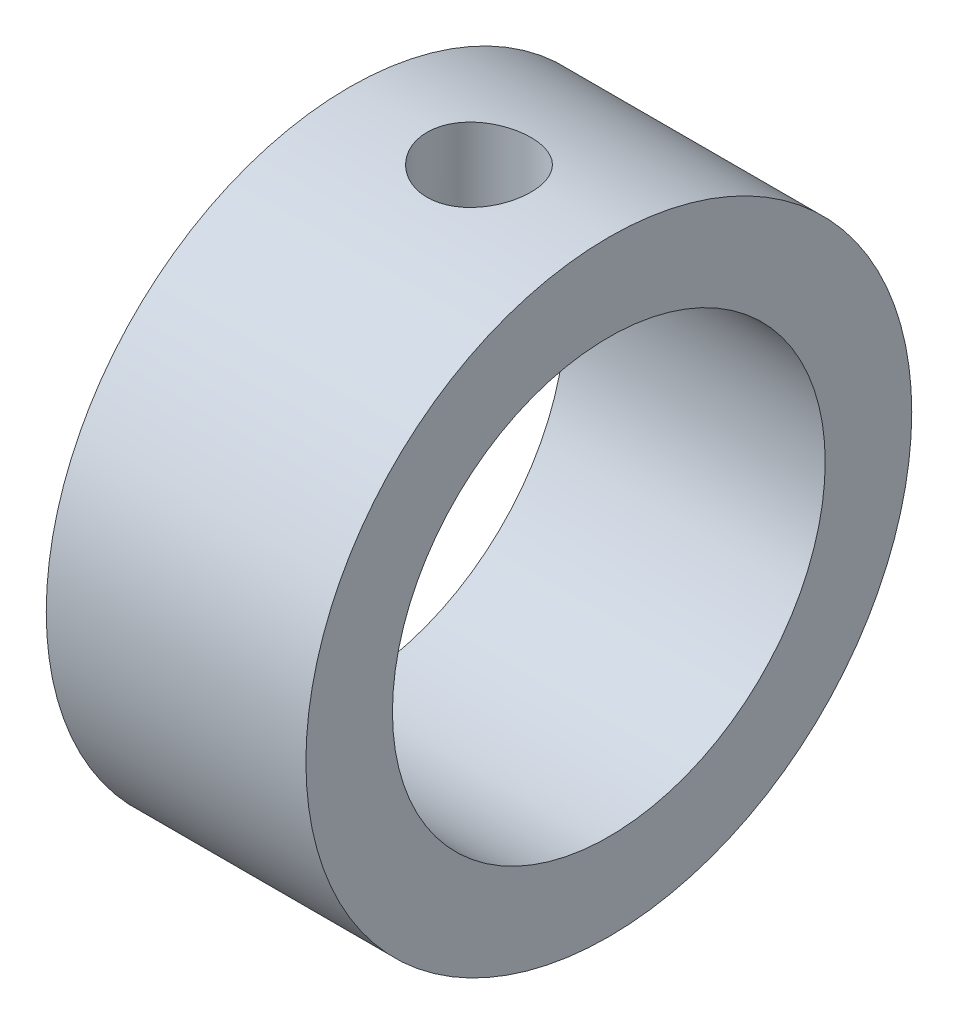
ISO-10303-21;
HEADER;
FILE_DESCRIPTION(('STEP AP214'),'2;1');
FILE_NAME('part.step','',(''),(''),'','','');
FILE_SCHEMA(('AUTOMOTIVE_DESIGN { 1 0 10303 214 1 1 1 1 }'));
ENDSEC;
DATA;
#1=APPLICATION_CONTEXT('core data for automotive mechanical design processes');
#2=APPLICATION_PROTOCOL_DEFINITION('international standard','automotive_design',2000,#1);
#3=PRODUCT_CONTEXT('',#1,'mechanical');
#4=PRODUCT('Part','Part','',(#3));
#5=PRODUCT_RELATED_PRODUCT_CATEGORY('part','',(#4));
#6=PRODUCT_DEFINITION_FORMATION('','',#4);
#7=PRODUCT_DEFINITION_CONTEXT('part definition',#1,'design');
#8=PRODUCT_DEFINITION('design','',#6,#7);
#9=PRODUCT_DEFINITION_SHAPE('','',#8);
#10=(LENGTH_UNIT() NAMED_UNIT(*) SI_UNIT(.MILLI.,.METRE.));
#11=(NAMED_UNIT(*) PLANE_ANGLE_UNIT() SI_UNIT($,.RADIAN.));
#12=(NAMED_UNIT(*) SI_UNIT($,.STERADIAN.) SOLID_ANGLE_UNIT());
#13=UNCERTAINTY_MEASURE_WITH_UNIT(LENGTH_MEASURE(1.E-05),#10,'distance_accuracy_value','');
#14=(GEOMETRIC_REPRESENTATION_CONTEXT(3) GLOBAL_UNCERTAINTY_ASSIGNED_CONTEXT((#13)) GLOBAL_UNIT_ASSIGNED_CONTEXT((#10,
#11,#12)) REPRESENTATION_CONTEXT('',''));
#15=CARTESIAN_POINT('',(0.,0.,0.));
#16=DIRECTION('',(0.,0.,1.));
#17=DIRECTION('',(1.,0.,0.));
#18=AXIS2_PLACEMENT_3D('',#15,#16,#17);
#19=CARTESIAN_POINT('',(15.,0.,0.));
#20=DIRECTION('',(-1.,0.,0.));
#21=DIRECTION('',(0.,0.,1.));
#22=AXIS2_PLACEMENT_3D('',#19,#20,#21);
#23=CYLINDRICAL_SURFACE('',#22,17.5);
#24=CARTESIAN_POINT('',(15.,0.,0.));
#25=DIRECTION('',(1.,0.,0.));
#26=DIRECTION('',(0.,0.,-1.));
#27=AXIS2_PLACEMENT_3D('',#24,#25,#26);
#28=CIRCLE('',#27,17.5);
#29=CARTESIAN_POINT('',(15.,0.,-17.5));
#30=VERTEX_POINT('',#29);
#31=EDGE_CURVE('E10',#30,#30,#28,.T.);
#32=ORIENTED_EDGE('',*,*,#31,.F.);
#33=EDGE_LOOP('',(#32));
#34=FACE_BOUND('',#33,.T.);
#35=CARTESIAN_POINT('',(0.,0.,0.));
#36=DIRECTION('',(1.,0.,0.));
#37=DIRECTION('',(0.,0.,-1.));
#38=AXIS2_PLACEMENT_3D('',#35,#36,#37);
#39=CIRCLE('',#38,17.5);
#40=CARTESIAN_POINT('',(0.,0.,-17.5));
#41=VERTEX_POINT('',#40);
#42=EDGE_CURVE('E43',#41,#41,#39,.T.);
#43=ORIENTED_EDGE('',*,*,#42,.T.);
#44=EDGE_LOOP('',(#43));
#45=FACE_BOUND('',#44,.T.);
#46=CARTESIAN_POINT('',(7.5,17.2409396495667,-3.));
#47=CARTESIAN_POINT('',(7.33282246032797,17.2409427238107,-2.99999334322019));
#48=CARTESIAN_POINT('',(7.1655553898746,17.2433975799678,-2.9859784908008));
#49=CARTESIAN_POINT('',(6.83571955276889,17.2529421043199,-2.93031666162569));
#50=CARTESIAN_POINT('',(6.67315518232045,17.260035971715,-2.88864464929492));
#51=CARTESIAN_POINT('',(6.35754570353687,17.2780319968807,-2.77897046037278));
#52=CARTESIAN_POINT('',(6.20449257087325,17.2889308916418,-2.71099083852852));
#53=CARTESIAN_POINT('',(5.91197929064788,17.313305084328,-2.55068812102202));
#54=CARTESIAN_POINT('',(5.77251771872825,17.3267801118422,-2.45836757998599));
#55=CARTESIAN_POINT('',(5.50967769550386,17.3549451758276,-2.25097753821767));
#56=CARTESIAN_POINT('',(5.38646144840326,17.3696453757954,-2.13570381628917));
#57=CARTESIAN_POINT('',(5.16101956179492,17.3985142730382,-1.8861209742386));
#58=CARTESIAN_POINT('',(5.05879519478093,17.4126829380499,-1.75181070098527));
#59=CARTESIAN_POINT('',(4.87762718746509,17.4390002009036,-1.46691308220606));
#60=CARTESIAN_POINT('',(4.79883495204563,17.4511354492007,-1.31622811896212));
#61=CARTESIAN_POINT('',(4.66774149755397,17.4719053147098,-1.00351837852194));
#62=CARTESIAN_POINT('',(4.61543845704082,17.4805401726064,-0.841494381888664));
#63=CARTESIAN_POINT('',(4.5393054207373,17.4932645851018,-0.51238286841017));
#64=CARTESIAN_POINT('',(4.51520267127088,17.4973976536599,-0.345360157307003));
#65=CARTESIAN_POINT('',(4.49530588275657,17.5008024112351,-0.00959366953916501));
#66=CARTESIAN_POINT('',(4.4995098130732,17.500074448968,0.159149982803277));
#67=CARTESIAN_POINT('',(4.53589511071027,17.4938735157789,0.491702223591268));
#68=CARTESIAN_POINT('',(4.56778290993075,17.4884503360207,0.655543993481226));
#69=CARTESIAN_POINT('',(4.65816805787996,17.4735238964266,0.975516328537305));
#70=CARTESIAN_POINT('',(4.71666625338242,17.4640205067542,1.13164664814083));
#71=CARTESIAN_POINT('',(4.85890075078884,17.4419170029363,1.43263245757703));
#72=CARTESIAN_POINT('',(4.94275722592168,17.4293021974191,1.57743003521027));
#73=CARTESIAN_POINT('',(5.13323975639982,17.402375995437,1.85100900942164));
#74=CARTESIAN_POINT('',(5.23986775861394,17.3880644539551,1.9797890350765));
#75=CARTESIAN_POINT('',(5.47449255120822,17.3591182543925,2.21941290689028));
#76=CARTESIAN_POINT('',(5.60274598624269,17.344481806616,2.33000539360505));
#77=CARTESIAN_POINT('',(5.8761184279323,17.3167125731742,2.52814283244136));
#78=CARTESIAN_POINT('',(6.02123760813946,17.3035798029848,2.61568754736626));
#79=CARTESIAN_POINT('',(6.32452274188632,17.280303555666,2.76529859974533));
#80=CARTESIAN_POINT('',(6.48270460081445,17.2701637936693,2.82733330960205));
#81=CARTESIAN_POINT('',(6.80745673564648,17.2540820099746,2.92387975772742));
#82=CARTESIAN_POINT('',(6.97402622574217,17.2481395958225,2.95839406920571));
#83=CARTESIAN_POINT('',(7.30857247825451,17.2412016562193,2.99856320128749));
#84=CARTESIAN_POINT('',(7.47650490847694,17.2401446099915,3.00457695031049));
#85=CARTESIAN_POINT('',(7.8109762128296,17.2429330582015,2.98853197620301));
#86=CARTESIAN_POINT('',(7.97751514376714,17.2467783518012,2.96647440309381));
#87=CARTESIAN_POINT('',(8.3033231897104,17.258881270067,2.89521941159178));
#88=CARTESIAN_POINT('',(8.46263373133846,17.2671089866899,2.84620588243531));
#89=CARTESIAN_POINT('',(8.77078018367313,17.2870244527025,2.72262364312904));
#90=CARTESIAN_POINT('',(8.91961543459914,17.2987124197933,2.64805332503161));
#91=CARTESIAN_POINT('',(9.20418032548544,17.324373772823,2.47463177769395));
#92=CARTESIAN_POINT('',(9.33976828473403,17.3383682986708,2.37555125161584));
#93=CARTESIAN_POINT('',(9.59252245195547,17.3670046347296,2.15623532353636));
#94=CARTESIAN_POINT('',(9.70968728480254,17.381646493154,2.03599834380818));
#95=CARTESIAN_POINT('',(9.92358659555313,17.4101230054923,1.77618954233157));
#96=CARTESIAN_POINT('',(10.0200812579464,17.4239469640735,1.63641893008565));
#97=CARTESIAN_POINT('',(10.1882185513154,17.4490567338254,1.34244211015567));
#98=CARTESIAN_POINT('',(10.2598620216096,17.4603426307116,1.18823639022305));
#99=CARTESIAN_POINT('',(10.3758931308123,17.4790582835881,0.870468175561604));
#100=CARTESIAN_POINT('',(10.4204045659635,17.4865055299022,0.706951958816392));
#101=CARTESIAN_POINT('',(10.4813060002943,17.4967788729714,0.374626699017908));
#102=CARTESIAN_POINT('',(10.4976984534333,17.4996053729806,0.205818119141563));
#103=CARTESIAN_POINT('',(10.5018227351743,17.5003125469087,-0.129988654143553));
#104=CARTESIAN_POINT('',(10.4899188499276,17.4982560843078,-0.296982352593286));
#105=CARTESIAN_POINT('',(10.4385784635561,17.4895572282876,-0.626554113404312));
#106=CARTESIAN_POINT('',(10.39914213888,17.4829148642582,-0.789132204057232));
#107=CARTESIAN_POINT('',(10.2939992002669,17.4657883771442,-1.10510688506267));
#108=CARTESIAN_POINT('',(10.2283252830409,17.4553090369673,-1.25851463077402));
#109=CARTESIAN_POINT('',(10.0726125899403,17.4316504514312,-1.55218949226268));
#110=CARTESIAN_POINT('',(9.98257255174676,17.4184710662012,-1.69245592673013));
#111=CARTESIAN_POINT('',(9.77940021091573,17.390671178074,-1.95769741805989));
#112=CARTESIAN_POINT('',(9.66600189541688,17.3760351790944,-2.08246711008153));
#113=CARTESIAN_POINT('',(9.41988909363515,17.3470767953719,-2.31133475460775));
#114=CARTESIAN_POINT('',(9.28717008821325,17.3327544849054,-2.41542785732055));
#115=CARTESIAN_POINT('',(9.00499349328928,17.305928230343,-2.60071215805767));
#116=CARTESIAN_POINT('',(8.85541731797514,17.2934388002337,-2.68172488708189));
#117=CARTESIAN_POINT('',(8.54462310549562,17.2718645235111,-2.81734831227997));
#118=CARTESIAN_POINT('',(8.38341674121731,17.2627763183619,-2.87198506892152));
#119=CARTESIAN_POINT('',(8.10134515644605,17.2510229398289,-2.94160477458961));
#120=CARTESIAN_POINT('',(7.98217632149403,17.2472630378549,-2.96346733737591));
#121=CARTESIAN_POINT('',(7.74202060940369,17.2422203045731,-2.99266721494119));
#122=CARTESIAN_POINT('',(7.62103376857119,17.2409374238649,-3.00000481939828));
#123=CARTESIAN_POINT('',(7.5,17.2409396495667,-3.));
#124=B_SPLINE_CURVE_WITH_KNOTS('',3,(#46,#47,#48,#49,#50,#51,#52,#53,#54,#55,#56,#57,#58,#59,
#60,#61,#62,#63,#64,#65,#66,#67,#68,#69,#70,#71,#72,#73,#74,#75,#76,#77,#78,#79,#80,#81,#82,#83,
#84,#85,#86,#87,#88,#89,#90,#91,#92,#93,#94,#95,#96,#97,#98,#99,#100,#101,#102,#103,#104,#105,
#106,#107,#108,#109,#110,#111,#112,#113,#114,#115,#116,#117,#118,#119,#120,#121,#122,#123),
.UNSPECIFIED.,.T.,.F.,(4,2,2,2,2,2,2,2,2,2,2,2,2,2,2,2,2,2,2,2,2,2,2,2,2,2,2,2,2,2,2,2,2,2,2,2,
2,2,4),(0.,0.501089951588282,1.00263411527872,1.50374923087268,2.00481177439394,
2.51054946507383,3.01631780370884,3.52528645944316,4.03422011289577,4.5381895582309,
5.04212285070943,5.54077666683347,6.03944635181164,6.54051729263445,7.0416310900563,
7.54917511935567,8.05672437185111,8.56490100620875,9.07303011950975,9.574742675659,
10.076434678393,10.5747459232883,11.0730885260168,11.576282258526,12.0795135322501,
12.588300132801,13.0970695480364,13.6034998598,14.1098859728562,14.6097882655281,
15.1096873544766,15.6089654137018,16.1082693436371,16.6136095803368,17.1190682073767,
17.6283353233665,18.1370982288975,18.4998862860552,18.8626671078861),.UNSPECIFIED.);
#125=CARTESIAN_POINT('',(7.5,17.2409396495667,-3.));
#126=VERTEX_POINT('',#125);
#127=EDGE_CURVE('E53',#126,#126,#124,.T.);
#128=ORIENTED_EDGE('',*,*,#127,.F.);
#129=EDGE_LOOP('',(#128));
#130=FACE_BOUND('',#129,.T.);
#131=ADVANCED_FACE('F30',(#34,#45,#130),#23,.T.);
#132=CARTESIAN_POINT('',(15.,0.,0.));
#133=DIRECTION('',(-1.,0.,0.));
#134=DIRECTION('',(0.,0.,1.));
#135=AXIS2_PLACEMENT_3D('',#132,#133,#134);
#136=CYLINDRICAL_SURFACE('',#135,12.5);
#137=CARTESIAN_POINT('',(0.,0.,0.));
#138=DIRECTION('',(1.,0.,0.));
#139=DIRECTION('',(0.,0.,-1.));
#140=AXIS2_PLACEMENT_3D('',#137,#138,#139);
#141=CIRCLE('',#140,12.5);
#142=CARTESIAN_POINT('',(0.,0.,-12.5));
#143=VERTEX_POINT('',#142);
#144=EDGE_CURVE('E50',#143,#143,#141,.T.);
#145=ORIENTED_EDGE('',*,*,#144,.F.);
#146=EDGE_LOOP('',(#145));
#147=FACE_BOUND('',#146,.T.);
#148=CARTESIAN_POINT('',(15.,0.,0.));
#149=DIRECTION('',(1.,0.,0.));
#150=DIRECTION('',(0.,0.,-1.));
#151=AXIS2_PLACEMENT_3D('',#148,#149,#150);
#152=CIRCLE('',#151,12.5);
#153=CARTESIAN_POINT('',(15.,0.,-12.5));
#154=VERTEX_POINT('',#153);
#155=EDGE_CURVE('E48',#154,#154,#152,.T.);
#156=ORIENTED_EDGE('',*,*,#155,.T.);
#157=EDGE_LOOP('',(#156));
#158=FACE_BOUND('',#157,.T.);
#159=CARTESIAN_POINT('',(7.5,12.1346610995116,-3.));
#160=CARTESIAN_POINT('',(7.33411368605636,12.1346643709057,-2.99999492639599));
#161=CARTESIAN_POINT('',(7.16816969817756,12.1380998279897,-2.98619401575549));
#162=CARTESIAN_POINT('',(6.84103164728038,12.1514386999622,-2.93143372377318));
#163=CARTESIAN_POINT('',(6.67984063651202,12.1613461803941,-2.8904572712724));
#164=CARTESIAN_POINT('',(6.36698770459709,12.1864438536979,-2.78273587845348));
#165=CARTESIAN_POINT('',(6.21531436580599,12.2016275682829,-2.71602252749926));
#166=CARTESIAN_POINT('',(5.92530045634281,12.2355589227548,-2.55881551789466));
#167=CARTESIAN_POINT('',(5.78696017633045,12.2543066403104,-2.46832134098417));
#168=CARTESIAN_POINT('',(5.52473118505982,12.2936793084446,-2.26416092165145));
#169=CARTESIAN_POINT('',(5.40115284401048,12.3143323081787,-2.15010136587795));
#170=CARTESIAN_POINT('',(5.17468460556583,12.3549444196641,-1.90289576315871));
#171=CARTESIAN_POINT('',(5.07179652880738,12.3749034702238,-1.7697480383165));
#172=CARTESIAN_POINT('',(4.88837356729399,12.4121875957975,-1.48603435008244));
#173=CARTESIAN_POINT('',(4.80814147645072,12.429475709008,-1.33526735140698));
#174=CARTESIAN_POINT('',(4.67427346268216,12.4591511096292,-1.0219036434405));
#175=CARTESIAN_POINT('',(4.62063393185468,12.471539061815,-0.859308542342423));
#176=CARTESIAN_POINT('',(4.54246184561352,12.4898200905274,-0.530137152798908));
#177=CARTESIAN_POINT('',(4.51740278579179,12.4958305032045,-0.363692527540998));
#178=CARTESIAN_POINT('',(4.49545248030836,12.5010873481438,-0.0288605739758572));
#179=CARTESIAN_POINT('',(4.49855738407585,12.5003347050497,0.13952648561831));
#180=CARTESIAN_POINT('',(4.53246370078499,12.4922383642801,0.469819197188797));
#181=CARTESIAN_POINT('',(4.56269708416856,12.4850298487431,0.631786969117106));
#182=CARTESIAN_POINT('',(4.64909173796286,12.4649879597451,0.948279915829272));
#183=CARTESIAN_POINT('',(4.70525432510285,12.4521543006312,1.10280471220598));
#184=CARTESIAN_POINT('',(4.84238683274778,12.4220937673228,1.40154850796015));
#185=CARTESIAN_POINT('',(4.92356325576841,12.4048305309055,1.54566890739797));
#186=CARTESIAN_POINT('',(5.10826343366629,12.3677903650575,1.81844374815069));
#187=CARTESIAN_POINT('',(5.21179080077329,12.3480130295253,1.94709568430373));
#188=CARTESIAN_POINT('',(5.4413154010846,12.307523454591,2.18866676072892));
#189=CARTESIAN_POINT('',(5.56780936616896,12.2868002024656,2.30111257110784));
#190=CARTESIAN_POINT('',(5.83807563615842,12.247210122564,2.50329554889259));
#191=CARTESIAN_POINT('',(5.98184862390317,12.2283433682075,2.59303181841776));
#192=CARTESIAN_POINT('',(6.28346525626311,12.1945661246798,2.74751986313759));
#193=CARTESIAN_POINT('',(6.44136505107637,12.1796724534131,2.81216594132899));
#194=CARTESIAN_POINT('',(6.76623312347683,12.155748323081,2.91385324316721));
#195=CARTESIAN_POINT('',(6.93319962468333,12.1467167199581,2.95089985341171));
#196=CARTESIAN_POINT('',(7.26709338006787,12.1357772660229,2.99556850234642));
#197=CARTESIAN_POINT('',(7.43392207251082,12.1337008786289,3.0038868332891));
#198=CARTESIAN_POINT('',(7.7665831940748,12.1364495609797,2.99276203410493));
#199=CARTESIAN_POINT('',(7.93241570580372,12.1412740503119,2.97332123871795));
#200=CARTESIAN_POINT('',(8.25584591726093,12.1571201522343,2.90783852027801));
#201=CARTESIAN_POINT('',(8.41352917591692,12.1680489760353,2.86219461484814));
#202=CARTESIAN_POINT('',(8.71900782066706,12.1947857126682,2.74603914988784));
#203=CARTESIAN_POINT('',(8.8668021054363,12.2105941678427,2.6755248260303));
#204=CARTESIAN_POINT('',(9.15127875220395,12.2456689266469,2.51014743676234));
#205=CARTESIAN_POINT('',(9.28770937400604,12.2649930224287,2.41486385815303));
#206=CARTESIAN_POINT('',(9.54290073389391,12.3047764880024,2.2031905161038));
#207=CARTESIAN_POINT('',(9.66165880098545,12.3252360287629,2.08679756812263));
#208=CARTESIAN_POINT('',(9.88091500960924,12.3655511140332,1.8330286051264));
#209=CARTESIAN_POINT('',(9.98093375598967,12.3853821651221,1.69523379949056));
#210=CARTESIAN_POINT('',(10.156408463085,12.4217193399952,1.40439761806721));
#211=CARTESIAN_POINT('',(10.2318656724447,12.438225632785,1.25135701785302));
#212=CARTESIAN_POINT('',(10.355447477275,12.4659520953338,0.935406182533393));
#213=CARTESIAN_POINT('',(10.4037623205216,12.4772089625634,0.772573732033522));
#214=CARTESIAN_POINT('',(10.4722678203969,12.4933282808784,0.440797516621209));
#215=CARTESIAN_POINT('',(10.4924634527555,12.4981918632553,0.271854838350956));
#216=CARTESIAN_POINT('',(10.503895867787,12.5009346170348,-0.0628273325379075));
#217=CARTESIAN_POINT('',(10.4958427559416,12.4989850590467,-0.22854154859205));
#218=CARTESIAN_POINT('',(10.4526200369824,12.4886960978661,-0.556181588106272));
#219=CARTESIAN_POINT('',(10.4174511235913,12.4803568581455,-0.718107508375784));
#220=CARTESIAN_POINT('',(10.3213631748843,12.4582475403262,-1.03289533638029));
#221=CARTESIAN_POINT('',(10.2605634305592,12.4445026408745,-1.18579554017999));
#222=CARTESIAN_POINT('',(10.1150497558514,12.4130357959962,-1.47930912419136));
#223=CARTESIAN_POINT('',(10.0303330262537,12.3953133850962,-1.61992106367531));
#224=CARTESIAN_POINT('',(9.83717452572309,12.3573152907204,-1.88826701153781));
#225=CARTESIAN_POINT('',(9.72824492925642,12.3369914041701,-2.01564306622629));
#226=CARTESIAN_POINT('',(9.49071238941027,12.2963112747441,-2.25054951565269));
#227=CARTESIAN_POINT('',(9.36210455926369,12.2759550250775,-2.35807496614236));
#228=CARTESIAN_POINT('',(9.08626060583986,12.2371275634283,-2.55199485185679));
#229=CARTESIAN_POINT('',(8.938747379493,12.2186938455572,-2.63800316633773));
#230=CARTESIAN_POINT('',(8.63093815349446,12.1862909651906,-2.78387070894251));
#231=CARTESIAN_POINT('',(8.47065208432893,12.1723183758181,-2.84375002144868));
#232=CARTESIAN_POINT('',(8.17540714648592,12.1527391085338,-2.92614436386637));
#233=CARTESIAN_POINT('',(8.0419291717888,12.1460087939348,-2.95378236710749));
#234=CARTESIAN_POINT('',(7.7723136259292,12.1369686046644,-2.99071161192546));
#235=CARTESIAN_POINT('',(7.63617624557697,12.1346584140208,-3.00000416492674));
#236=CARTESIAN_POINT('',(7.5,12.1346610995116,-3.));
#237=B_SPLINE_CURVE_WITH_KNOTS('',3,(#159,#160,#161,#162,#163,#164,#165,#166,#167,#168,#169,
#170,#171,#172,#173,#174,#175,#176,#177,#178,#179,#180,#181,#182,#183,#184,#185,#186,#187,#188,
#189,#190,#191,#192,#193,#194,#195,#196,#197,#198,#199,#200,#201,#202,#203,#204,#205,#206,#207,
#208,#209,#210,#211,#212,#213,#214,#215,#216,#217,#218,#219,#220,#221,#222,#223,#224,#225,#226,
#227,#228,#229,#230,#231,#232,#233,#234,#235,#236),.UNSPECIFIED.,.T.,.F.,(4,2,2,2,2,2,2,2,2,2,2,
2,2,2,2,2,2,2,2,2,2,2,2,2,2,2,2,2,2,2,2,2,2,2,2,2,2,2,4),(0.,0.497159212189433,0.9946310265389,
1.49149417875254,1.98836816009861,2.49432418194045,3.00032470584734,3.51279830766303,
4.02520236141813,4.52800628486068,5.03074146609936,5.52318961529222,6.01566277459447,
6.51231571921414,7.00904899016388,7.51819168467208,8.02735450631452,8.5386395722652,
9.04982482437227,9.54852995993759,10.047193153326,10.5384749824062,11.0298114342859,
11.5301065260644,12.0304771548043,12.5422844123508,13.0540656468818,13.5622134292334,
14.0702712827588,14.5656502933719,15.0610166307768,15.5541024543049,16.047246011943,
16.5514085771014,17.0556965465884,17.56847227941,18.0808531634825,18.4890008491296,
18.8971193572843),.UNSPECIFIED.);
#238=CARTESIAN_POINT('',(7.5,12.1346610995116,-3.));
#239=VERTEX_POINT('',#238);
#240=EDGE_CURVE('E34',#239,#239,#237,.T.);
#241=ORIENTED_EDGE('',*,*,#240,.T.);
#242=EDGE_LOOP('',(#241));
#243=FACE_BOUND('',#242,.T.);
#244=ADVANCED_FACE('F65',(#147,#158,#243),#136,.F.);
#245=CARTESIAN_POINT('',(15.,0.,0.));
#246=DIRECTION('',(1.,0.,0.));
#247=DIRECTION('',(0.,0.,-1.));
#248=AXIS2_PLACEMENT_3D('',#245,#246,#247);
#249=PLANE('',#248);
#250=ORIENTED_EDGE('',*,*,#31,.T.);
#251=EDGE_LOOP('',(#250));
#252=FACE_BOUND('',#251,.T.);
#253=ORIENTED_EDGE('',*,*,#155,.F.);
#254=EDGE_LOOP('',(#253));
#255=FACE_BOUND('',#254,.T.);
#256=ADVANCED_FACE('F70',(#252,#255),#249,.T.);
#257=CARTESIAN_POINT('',(0.,0.,0.));
#258=DIRECTION('',(1.,0.,0.));
#259=DIRECTION('',(0.,0.,-1.));
#260=AXIS2_PLACEMENT_3D('',#257,#258,#259);
#261=PLANE('',#260);
#262=ORIENTED_EDGE('',*,*,#42,.F.);
#263=EDGE_LOOP('',(#262));
#264=FACE_BOUND('',#263,.T.);
#265=ORIENTED_EDGE('',*,*,#144,.T.);
#266=EDGE_LOOP('',(#265));
#267=FACE_BOUND('',#266,.T.);
#268=ADVANCED_FACE('F63',(#264,#267),#261,.F.);
#269=CARTESIAN_POINT('',(7.5,30.,0.));
#270=DIRECTION('',(0.,-1.,0.));
#271=DIRECTION('',(0.,0.,-1.));
#272=AXIS2_PLACEMENT_3D('',#269,#270,#271);
#273=CYLINDRICAL_SURFACE('',#272,3.);
#274=ORIENTED_EDGE('',*,*,#240,.F.);
#275=EDGE_LOOP('',(#274));
#276=FACE_BOUND('',#275,.T.);
#277=ORIENTED_EDGE('',*,*,#127,.T.);
#278=EDGE_LOOP('',(#277));
#279=FACE_BOUND('',#278,.T.);
#280=ADVANCED_FACE('F60',(#276,#279),#273,.F.);
#281=CLOSED_SHELL('',(#131,#244,#256,#268,#280));
#282=MANIFOLD_SOLID_BREP('B2',#281);
#283=ADVANCED_BREP_SHAPE_REPRESENTATION('',(#18,#282),#14);
#284=SHAPE_DEFINITION_REPRESENTATION(#9,#283);
ENDSEC;
END-ISO-10303-21;
